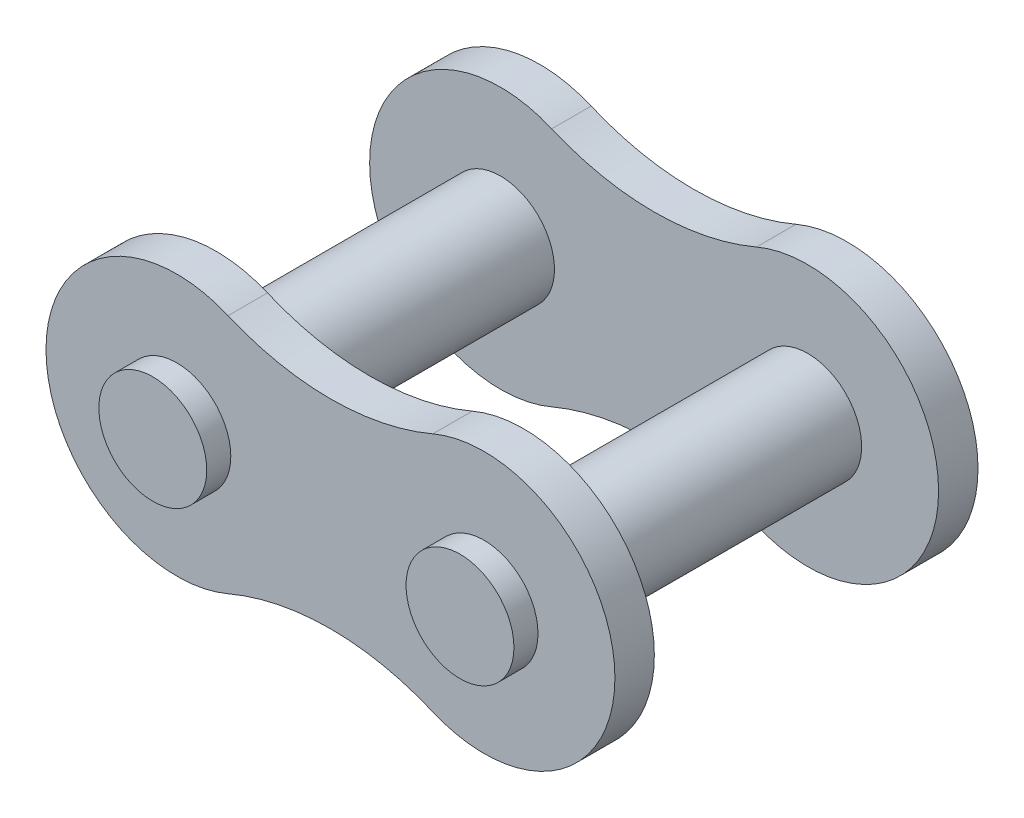
ISO-10303-21;
HEADER;
FILE_DESCRIPTION(('STEP AP214'),'2;1');
FILE_NAME('part.step','',(''),(''),'','','');
FILE_SCHEMA(('AUTOMOTIVE_DESIGN { 1 0 10303 214 1 1 1 1 }'));
ENDSEC;
DATA;
#1=APPLICATION_CONTEXT('core data for automotive mechanical design processes');
#2=APPLICATION_PROTOCOL_DEFINITION('international standard','automotive_design',2000,#1);
#3=PRODUCT_CONTEXT('',#1,'mechanical');
#4=PRODUCT('Part','Part','',(#3));
#5=PRODUCT_RELATED_PRODUCT_CATEGORY('part','',(#4));
#6=PRODUCT_DEFINITION_FORMATION('','',#4);
#7=PRODUCT_DEFINITION_CONTEXT('part definition',#1,'design');
#8=PRODUCT_DEFINITION('design','',#6,#7);
#9=PRODUCT_DEFINITION_SHAPE('','',#8);
#10=(LENGTH_UNIT() NAMED_UNIT(*) SI_UNIT(.MILLI.,.METRE.));
#11=(NAMED_UNIT(*) PLANE_ANGLE_UNIT() SI_UNIT($,.RADIAN.));
#12=(NAMED_UNIT(*) SI_UNIT($,.STERADIAN.) SOLID_ANGLE_UNIT());
#13=UNCERTAINTY_MEASURE_WITH_UNIT(LENGTH_MEASURE(1.E-05),#10,'distance_accuracy_value','');
#14=(GEOMETRIC_REPRESENTATION_CONTEXT(3) GLOBAL_UNCERTAINTY_ASSIGNED_CONTEXT((#13)) GLOBAL_UNIT_ASSIGNED_CONTEXT((#10,
#11,#12)) REPRESENTATION_CONTEXT('',''));
#15=CARTESIAN_POINT('',(0.,0.,0.));
#16=DIRECTION('',(0.,0.,1.));
#17=DIRECTION('',(1.,0.,0.));
#18=AXIS2_PLACEMENT_3D('',#15,#16,#17);
#19=CARTESIAN_POINT('',(-6.35,0.,8.5));
#20=DIRECTION('',(0.,0.,-1.));
#21=DIRECTION('',(-1.,0.,0.));
#22=AXIS2_PLACEMENT_3D('',#19,#20,#21);
#23=CYLINDRICAL_SURFACE('',#22,2.23);
#24=CARTESIAN_POINT('',(-6.35,0.,5.875));
#25=DIRECTION('',(0.,0.,1.));
#26=DIRECTION('',(1.,0.,0.));
#27=AXIS2_PLACEMENT_3D('',#24,#25,#26);
#28=CIRCLE('',#27,2.23);
#29=CARTESIAN_POINT('',(-4.12,0.,5.875));
#30=VERTEX_POINT('',#29);
#31=EDGE_CURVE('E196',#30,#30,#28,.T.);
#32=ORIENTED_EDGE('',*,*,#31,.F.);
#33=EDGE_LOOP('',(#32));
#34=FACE_BOUND('',#33,.T.);
#35=CARTESIAN_POINT('',(-6.35,0.,-5.875));
#36=DIRECTION('',(0.,0.,-1.));
#37=DIRECTION('',(-1.,0.,0.));
#38=AXIS2_PLACEMENT_3D('',#35,#36,#37);
#39=CIRCLE('',#38,2.23);
#40=CARTESIAN_POINT('',(-8.58,0.,-5.875));
#41=VERTEX_POINT('',#40);
#42=EDGE_CURVE('E11',#41,#41,#39,.T.);
#43=ORIENTED_EDGE('',*,*,#42,.F.);
#44=EDGE_LOOP('',(#43));
#45=FACE_BOUND('',#44,.T.);
#46=ADVANCED_FACE('F39',(#34,#45),#23,.T.);
#47=CARTESIAN_POINT('',(6.35,0.,8.5));
#48=DIRECTION('',(0.,0.,-1.));
#49=DIRECTION('',(-1.,0.,0.));
#50=AXIS2_PLACEMENT_3D('',#47,#48,#49);
#51=CYLINDRICAL_SURFACE('',#50,2.23);
#52=CARTESIAN_POINT('',(6.35,0.,5.875));
#53=DIRECTION('',(0.,0.,1.));
#54=DIRECTION('',(1.,0.,0.));
#55=AXIS2_PLACEMENT_3D('',#52,#53,#54);
#56=CIRCLE('',#55,2.23);
#57=CARTESIAN_POINT('',(8.58,0.,5.875));
#58=VERTEX_POINT('',#57);
#59=EDGE_CURVE('E202',#58,#58,#56,.F.);
#60=ORIENTED_EDGE('',*,*,#59,.T.);
#61=EDGE_LOOP('',(#60));
#62=FACE_BOUND('',#61,.T.);
#63=CARTESIAN_POINT('',(6.35,0.,-5.875));
#64=DIRECTION('',(0.,0.,-1.));
#65=DIRECTION('',(-1.,0.,0.));
#66=AXIS2_PLACEMENT_3D('',#63,#64,#65);
#67=CIRCLE('',#66,2.23);
#68=CARTESIAN_POINT('',(4.12,0.,-5.875));
#69=VERTEX_POINT('',#68);
#70=EDGE_CURVE('E49',#69,#69,#67,.T.);
#71=ORIENTED_EDGE('',*,*,#70,.F.);
#72=EDGE_LOOP('',(#71));
#73=FACE_BOUND('',#72,.T.);
#74=ADVANCED_FACE('F212',(#62,#73),#51,.T.);
#75=CARTESIAN_POINT('',(-6.35,0.,7.505));
#76=DIRECTION('',(0.,0.,1.));
#77=DIRECTION('',(1.,0.,0.));
#78=AXIS2_PLACEMENT_3D('',#75,#76,#77);
#79=CIRCLE('',#78,2.23);
#80=CARTESIAN_POINT('',(-4.12,0.,7.505));
#81=VERTEX_POINT('',#80);
#82=EDGE_CURVE('E192',#81,#81,#79,.T.);
#83=ORIENTED_EDGE('',*,*,#82,.T.);
#84=EDGE_LOOP('',(#83));
#85=FACE_BOUND('',#84,.T.);
#86=CARTESIAN_POINT('',(-6.35,0.,8.5));
#87=DIRECTION('',(0.,0.,1.));
#88=DIRECTION('',(1.,0.,0.));
#89=AXIS2_PLACEMENT_3D('',#86,#87,#88);
#90=CIRCLE('',#89,2.23);
#91=CARTESIAN_POINT('',(-4.12,0.,8.5));
#92=VERTEX_POINT('',#91);
#93=EDGE_CURVE('E193',#92,#92,#90,.T.);
#94=ORIENTED_EDGE('',*,*,#93,.F.);
#95=EDGE_LOOP('',(#94));
#96=FACE_BOUND('',#95,.T.);
#97=ADVANCED_FACE('F41',(#85,#96),#23,.T.);
#98=CARTESIAN_POINT('',(-6.35,0.,8.5));
#99=DIRECTION('',(0.,0.,1.));
#100=DIRECTION('',(1.,0.,0.));
#101=AXIS2_PLACEMENT_3D('',#98,#99,#100);
#102=PLANE('',#101);
#103=ORIENTED_EDGE('',*,*,#93,.T.);
#104=EDGE_LOOP('',(#103));
#105=FACE_BOUND('',#104,.T.);
#106=ADVANCED_FACE('F223',(#105),#102,.T.);
#107=CARTESIAN_POINT('',(0.,-14.9253442171362,7.505));
#108=DIRECTION('',(0.,0.,-1.));
#109=DIRECTION('',(-1.,0.,0.));
#110=AXIS2_PLACEMENT_3D('',#107,#108,#109);
#111=CYLINDRICAL_SURFACE('',#110,10.81);
#112=CARTESIAN_POINT('',(0.,-14.9253442171362,5.875));
#113=DIRECTION('',(0.,0.,-1.));
#114=DIRECTION('',(1.,0.,0.));
#115=AXIS2_PLACEMENT_3D('',#112,#113,#114);
#116=CIRCLE('',#115,10.81);
#117=CARTESIAN_POINT('',(-4.23202836004932,-4.97818201077106,5.875));
#118=VERTEX_POINT('',#117);
#119=CARTESIAN_POINT('',(4.23202836004932,-4.97818201077106,5.875));
#120=VERTEX_POINT('',#119);
#121=EDGE_CURVE('E171',#118,#120,#116,.T.);
#122=ORIENTED_EDGE('',*,*,#121,.T.);
#123=DIRECTION('',(0.,0.,-1.));
#124=VECTOR('',#123,1.);
#125=CARTESIAN_POINT('',(4.23202836004932,-4.97818201077106,7.505));
#126=LINE('',#125,#124);
#127=CARTESIAN_POINT('',(4.23202836004932,-4.97818201077106,7.505));
#128=VERTEX_POINT('',#127);
#129=EDGE_CURVE('E190',#128,#120,#126,.T.);
#130=ORIENTED_EDGE('',*,*,#129,.F.);
#131=CARTESIAN_POINT('',(0.,-14.9253442171362,7.505));
#132=DIRECTION('',(0.,0.,-1.));
#133=DIRECTION('',(1.,0.,0.));
#134=AXIS2_PLACEMENT_3D('',#131,#132,#133);
#135=CIRCLE('',#134,10.81);
#136=CARTESIAN_POINT('',(-4.23202836004932,-4.97818201077106,7.505));
#137=VERTEX_POINT('',#136);
#138=EDGE_CURVE('E172',#137,#128,#135,.T.);
#139=ORIENTED_EDGE('',*,*,#138,.F.);
#140=DIRECTION('',(0.,0.,-1.));
#141=VECTOR('',#140,1.);
#142=CARTESIAN_POINT('',(-4.23202836004932,-4.97818201077106,7.505));
#143=LINE('',#142,#141);
#144=EDGE_CURVE('E178',#137,#118,#143,.T.);
#145=ORIENTED_EDGE('',*,*,#144,.T.);
#146=EDGE_LOOP('',(#122,#130,#139,#145));
#147=FACE_BOUND('',#146,.T.);
#148=ADVANCED_FACE('F258',(#147),#111,.F.);
#149=CARTESIAN_POINT('',(6.35,0.,7.505));
#150=DIRECTION('',(0.,0.,-1.));
#151=DIRECTION('',(-1.,0.,0.));
#152=AXIS2_PLACEMENT_3D('',#149,#150,#151);
#153=CYLINDRICAL_SURFACE('',#152,5.41);
#154=CARTESIAN_POINT('',(6.35,0.,5.875));
#155=DIRECTION('',(0.,0.,1.));
#156=DIRECTION('',(1.,0.,0.));
#157=AXIS2_PLACEMENT_3D('',#154,#155,#156);
#158=CIRCLE('',#157,5.41);
#159=CARTESIAN_POINT('',(4.23202836004932,4.97818201077106,5.875));
#160=VERTEX_POINT('',#159);
#161=EDGE_CURVE('E181',#120,#160,#158,.T.);
#162=ORIENTED_EDGE('',*,*,#161,.T.);
#163=DIRECTION('',(0.,0.,-1.));
#164=VECTOR('',#163,1.);
#165=CARTESIAN_POINT('',(4.23202836004932,4.97818201077106,7.505));
#166=LINE('',#165,#164);
#167=CARTESIAN_POINT('',(4.23202836004932,4.97818201077106,7.505));
#168=VERTEX_POINT('',#167);
#169=EDGE_CURVE('E188',#168,#160,#166,.T.);
#170=ORIENTED_EDGE('',*,*,#169,.F.);
#171=CARTESIAN_POINT('',(6.35,0.,7.505));
#172=DIRECTION('',(0.,0.,1.));
#173=DIRECTION('',(1.,0.,0.));
#174=AXIS2_PLACEMENT_3D('',#171,#172,#173);
#175=CIRCLE('',#174,5.41);
#176=EDGE_CURVE('E90',#128,#168,#175,.T.);
#177=ORIENTED_EDGE('',*,*,#176,.F.);
#178=ORIENTED_EDGE('',*,*,#129,.T.);
#179=EDGE_LOOP('',(#162,#170,#177,#178));
#180=FACE_BOUND('',#179,.T.);
#181=ADVANCED_FACE('F260',(#180),#153,.T.);
#182=CARTESIAN_POINT('',(0.,14.9253442171362,7.505));
#183=DIRECTION('',(0.,0.,-1.));
#184=DIRECTION('',(-1.,0.,0.));
#185=AXIS2_PLACEMENT_3D('',#182,#183,#184);
#186=CYLINDRICAL_SURFACE('',#185,10.81);
#187=CARTESIAN_POINT('',(0.,14.9253442171362,5.875));
#188=DIRECTION('',(0.,0.,-1.));
#189=DIRECTION('',(1.,0.,0.));
#190=AXIS2_PLACEMENT_3D('',#187,#188,#189);
#191=CIRCLE('',#190,10.81);
#192=CARTESIAN_POINT('',(-4.23202836004932,4.97818201077106,5.875));
#193=VERTEX_POINT('',#192);
#194=EDGE_CURVE('E76',#160,#193,#191,.T.);
#195=ORIENTED_EDGE('',*,*,#194,.T.);
#196=DIRECTION('',(0.,0.,-1.));
#197=VECTOR('',#196,1.);
#198=CARTESIAN_POINT('',(-4.23202836004932,4.97818201077106,7.505));
#199=LINE('',#198,#197);
#200=CARTESIAN_POINT('',(-4.23202836004932,4.97818201077106,7.505));
#201=VERTEX_POINT('',#200);
#202=EDGE_CURVE('E186',#201,#193,#199,.T.);
#203=ORIENTED_EDGE('',*,*,#202,.F.);
#204=CARTESIAN_POINT('',(0.,14.9253442171362,7.505));
#205=DIRECTION('',(0.,0.,-1.));
#206=DIRECTION('',(1.,0.,0.));
#207=AXIS2_PLACEMENT_3D('',#204,#205,#206);
#208=CIRCLE('',#207,10.81);
#209=EDGE_CURVE('E175',#168,#201,#208,.T.);
#210=ORIENTED_EDGE('',*,*,#209,.F.);
#211=ORIENTED_EDGE('',*,*,#169,.T.);
#212=EDGE_LOOP('',(#195,#203,#210,#211));
#213=FACE_BOUND('',#212,.T.);
#214=ADVANCED_FACE('F263',(#213),#186,.F.);
#215=CARTESIAN_POINT('',(-6.35,0.,7.505));
#216=DIRECTION('',(0.,0.,-1.));
#217=DIRECTION('',(-1.,0.,0.));
#218=AXIS2_PLACEMENT_3D('',#215,#216,#217);
#219=CYLINDRICAL_SURFACE('',#218,5.41);
#220=CARTESIAN_POINT('',(-6.35,0.,5.875));
#221=DIRECTION('',(0.,0.,1.));
#222=DIRECTION('',(1.,0.,0.));
#223=AXIS2_PLACEMENT_3D('',#220,#221,#222);
#224=CIRCLE('',#223,5.41);
#225=EDGE_CURVE('E82',#193,#118,#224,.T.);
#226=ORIENTED_EDGE('',*,*,#225,.T.);
#227=ORIENTED_EDGE('',*,*,#144,.F.);
#228=CARTESIAN_POINT('',(-6.35,0.,7.505));
#229=DIRECTION('',(0.,0.,1.));
#230=DIRECTION('',(1.,0.,0.));
#231=AXIS2_PLACEMENT_3D('',#228,#229,#230);
#232=CIRCLE('',#231,5.41);
#233=EDGE_CURVE('E58',#201,#137,#232,.T.);
#234=ORIENTED_EDGE('',*,*,#233,.F.);
#235=ORIENTED_EDGE('',*,*,#202,.T.);
#236=EDGE_LOOP('',(#226,#227,#234,#235));
#237=FACE_BOUND('',#236,.T.);
#238=ADVANCED_FACE('F253',(#237),#219,.T.);
#239=CARTESIAN_POINT('',(-3.175,-7.46267210856808,7.505));
#240=DIRECTION('',(0.,0.,1.));
#241=DIRECTION('',(1.,0.,0.));
#242=AXIS2_PLACEMENT_3D('',#239,#240,#241);
#243=PLANE('',#242);
#244=CARTESIAN_POINT('',(6.35,0.,7.505));
#245=DIRECTION('',(0.,0.,1.));
#246=DIRECTION('',(1.,0.,0.));
#247=AXIS2_PLACEMENT_3D('',#244,#245,#246);
#248=CIRCLE('',#247,2.23);
#249=CARTESIAN_POINT('',(8.58,0.,7.505));
#250=VERTEX_POINT('',#249);
#251=EDGE_CURVE('E166',#250,#250,#248,.F.);
#252=ORIENTED_EDGE('',*,*,#251,.T.);
#253=EDGE_LOOP('',(#252));
#254=FACE_BOUND('',#253,.T.);
#255=ORIENTED_EDGE('',*,*,#82,.F.);
#256=EDGE_LOOP('',(#255));
#257=FACE_BOUND('',#256,.T.);
#258=ORIENTED_EDGE('',*,*,#138,.T.);
#259=ORIENTED_EDGE('',*,*,#176,.T.);
#260=ORIENTED_EDGE('',*,*,#209,.T.);
#261=ORIENTED_EDGE('',*,*,#233,.T.);
#262=EDGE_LOOP('',(#258,#259,#260,#261));
#263=FACE_BOUND('',#262,.T.);
#264=ADVANCED_FACE('F244',(#254,#257,#263),#243,.T.);
#265=CARTESIAN_POINT('',(-3.175,-7.46267210856808,5.875));
#266=DIRECTION('',(0.,0.,1.));
#267=DIRECTION('',(1.,0.,0.));
#268=AXIS2_PLACEMENT_3D('',#265,#266,#267);
#269=PLANE('',#268);
#270=ORIENTED_EDGE('',*,*,#59,.F.);
#271=EDGE_LOOP('',(#270));
#272=FACE_BOUND('',#271,.T.);
#273=ORIENTED_EDGE('',*,*,#31,.T.);
#274=EDGE_LOOP('',(#273));
#275=FACE_BOUND('',#274,.T.);
#276=ORIENTED_EDGE('',*,*,#121,.F.);
#277=ORIENTED_EDGE('',*,*,#225,.F.);
#278=ORIENTED_EDGE('',*,*,#194,.F.);
#279=ORIENTED_EDGE('',*,*,#161,.F.);
#280=EDGE_LOOP('',(#276,#277,#278,#279));
#281=FACE_BOUND('',#280,.T.);
#282=ADVANCED_FACE('F235',(#272,#275,#281),#269,.F.);
#283=ORIENTED_EDGE('',*,*,#251,.F.);
#284=EDGE_LOOP('',(#283));
#285=FACE_BOUND('',#284,.T.);
#286=CARTESIAN_POINT('',(6.35,0.,8.5));
#287=DIRECTION('',(0.,0.,1.));
#288=DIRECTION('',(1.,0.,0.));
#289=AXIS2_PLACEMENT_3D('',#286,#287,#288);
#290=CIRCLE('',#289,2.23);
#291=CARTESIAN_POINT('',(8.58,0.,8.5));
#292=VERTEX_POINT('',#291);
#293=EDGE_CURVE('E163',#292,#292,#290,.T.);
#294=ORIENTED_EDGE('',*,*,#293,.F.);
#295=EDGE_LOOP('',(#294));
#296=FACE_BOUND('',#295,.T.);
#297=ADVANCED_FACE('F217',(#285,#296),#51,.T.);
#298=CARTESIAN_POINT('',(6.35,0.,8.5));
#299=DIRECTION('',(0.,0.,1.));
#300=DIRECTION('',(1.,0.,0.));
#301=AXIS2_PLACEMENT_3D('',#298,#299,#300);
#302=PLANE('',#301);
#303=ORIENTED_EDGE('',*,*,#293,.T.);
#304=EDGE_LOOP('',(#303));
#305=FACE_BOUND('',#304,.T.);
#306=ADVANCED_FACE('F234',(#305),#302,.T.);
#307=CARTESIAN_POINT('',(0.,-14.9253442171362,-7.505));
#308=DIRECTION('',(0.,0.,1.));
#309=DIRECTION('',(1.,0.,0.));
#310=AXIS2_PLACEMENT_3D('',#307,#308,#309);
#311=CYLINDRICAL_SURFACE('',#310,10.81);
#312=CARTESIAN_POINT('',(0.,-14.9253442171362,-5.875));
#313=DIRECTION('',(0.,0.,-1.));
#314=DIRECTION('',(1.,0.,0.));
#315=AXIS2_PLACEMENT_3D('',#312,#313,#314);
#316=CIRCLE('',#315,10.81);
#317=CARTESIAN_POINT('',(-4.23202836004932,-4.97818201077106,-5.875));
#318=VERTEX_POINT('',#317);
#319=CARTESIAN_POINT('',(4.23202836004932,-4.97818201077106,-5.875));
#320=VERTEX_POINT('',#319);
#321=EDGE_CURVE('E123',#318,#320,#316,.T.);
#322=ORIENTED_EDGE('',*,*,#321,.F.);
#323=DIRECTION('',(0.,0.,1.));
#324=VECTOR('',#323,1.);
#325=CARTESIAN_POINT('',(-4.23202836004932,-4.97818201077106,-7.505));
#326=LINE('',#325,#324);
#327=CARTESIAN_POINT('',(-4.23202836004932,-4.97818201077106,-7.505));
#328=VERTEX_POINT('',#327);
#329=EDGE_CURVE('E117',#328,#318,#326,.T.);
#330=ORIENTED_EDGE('',*,*,#329,.F.);
#331=CARTESIAN_POINT('',(0.,-14.9253442171362,-7.505));
#332=DIRECTION('',(0.,0.,-1.));
#333=DIRECTION('',(1.,0.,0.));
#334=AXIS2_PLACEMENT_3D('',#331,#332,#333);
#335=CIRCLE('',#334,10.81);
#336=CARTESIAN_POINT('',(4.23202836004932,-4.97818201077106,-7.505));
#337=VERTEX_POINT('',#336);
#338=EDGE_CURVE('E120',#328,#337,#335,.T.);
#339=ORIENTED_EDGE('',*,*,#338,.T.);
#340=DIRECTION('',(0.,0.,1.));
#341=VECTOR('',#340,1.);
#342=CARTESIAN_POINT('',(4.23202836004932,-4.97818201077106,-7.505));
#343=LINE('',#342,#341);
#344=EDGE_CURVE('E146',#337,#320,#343,.T.);
#345=ORIENTED_EDGE('',*,*,#344,.T.);
#346=EDGE_LOOP('',(#322,#330,#339,#345));
#347=FACE_BOUND('',#346,.T.);
#348=ADVANCED_FACE('F119',(#347),#311,.F.);
#349=CARTESIAN_POINT('',(-6.35,0.,-7.505));
#350=DIRECTION('',(0.,0.,1.));
#351=DIRECTION('',(1.,0.,0.));
#352=AXIS2_PLACEMENT_3D('',#349,#350,#351);
#353=CYLINDRICAL_SURFACE('',#352,5.41);
#354=CARTESIAN_POINT('',(-6.35,0.,-5.875));
#355=DIRECTION('',(0.,0.,1.));
#356=DIRECTION('',(1.,0.,0.));
#357=AXIS2_PLACEMENT_3D('',#354,#355,#356);
#358=CIRCLE('',#357,5.41);
#359=CARTESIAN_POINT('',(-4.23202836004932,4.97818201077106,-5.875));
#360=VERTEX_POINT('',#359);
#361=EDGE_CURVE('E148',#360,#318,#358,.T.);
#362=ORIENTED_EDGE('',*,*,#361,.F.);
#363=DIRECTION('',(0.,0.,1.));
#364=VECTOR('',#363,1.);
#365=CARTESIAN_POINT('',(-4.23202836004932,4.97818201077106,-7.505));
#366=LINE('',#365,#364);
#367=CARTESIAN_POINT('',(-4.23202836004932,4.97818201077106,-7.505));
#368=VERTEX_POINT('',#367);
#369=EDGE_CURVE('E128',#368,#360,#366,.T.);
#370=ORIENTED_EDGE('',*,*,#369,.F.);
#371=CARTESIAN_POINT('',(-6.35,0.,-7.505));
#372=DIRECTION('',(0.,0.,1.));
#373=DIRECTION('',(1.,0.,0.));
#374=AXIS2_PLACEMENT_3D('',#371,#372,#373);
#375=CIRCLE('',#374,5.41);
#376=EDGE_CURVE('E134',#368,#328,#375,.T.);
#377=ORIENTED_EDGE('',*,*,#376,.T.);
#378=ORIENTED_EDGE('',*,*,#329,.T.);
#379=EDGE_LOOP('',(#362,#370,#377,#378));
#380=FACE_BOUND('',#379,.T.);
#381=ADVANCED_FACE('F140',(#380),#353,.T.);
#382=CARTESIAN_POINT('',(0.,14.9253442171362,-7.505));
#383=DIRECTION('',(0.,0.,1.));
#384=DIRECTION('',(1.,0.,0.));
#385=AXIS2_PLACEMENT_3D('',#382,#383,#384);
#386=CYLINDRICAL_SURFACE('',#385,10.81);
#387=CARTESIAN_POINT('',(0.,14.9253442171362,-5.875));
#388=DIRECTION('',(0.,0.,-1.));
#389=DIRECTION('',(1.,0.,0.));
#390=AXIS2_PLACEMENT_3D('',#387,#388,#389);
#391=CIRCLE('',#390,10.81);
#392=CARTESIAN_POINT('',(4.23202836004932,4.97818201077106,-5.875));
#393=VERTEX_POINT('',#392);
#394=EDGE_CURVE('E150',#393,#360,#391,.T.);
#395=ORIENTED_EDGE('',*,*,#394,.F.);
#396=DIRECTION('',(0.,0.,1.));
#397=VECTOR('',#396,1.);
#398=CARTESIAN_POINT('',(4.23202836004932,4.97818201077106,-7.505));
#399=LINE('',#398,#397);
#400=CARTESIAN_POINT('',(4.23202836004932,4.97818201077106,-7.505));
#401=VERTEX_POINT('',#400);
#402=EDGE_CURVE('E156',#401,#393,#399,.T.);
#403=ORIENTED_EDGE('',*,*,#402,.F.);
#404=CARTESIAN_POINT('',(0.,14.9253442171362,-7.505));
#405=DIRECTION('',(0.,0.,-1.));
#406=DIRECTION('',(1.,0.,0.));
#407=AXIS2_PLACEMENT_3D('',#404,#405,#406);
#408=CIRCLE('',#407,10.81);
#409=EDGE_CURVE('E141',#401,#368,#408,.T.);
#410=ORIENTED_EDGE('',*,*,#409,.T.);
#411=ORIENTED_EDGE('',*,*,#369,.T.);
#412=EDGE_LOOP('',(#395,#403,#410,#411));
#413=FACE_BOUND('',#412,.T.);
#414=ADVANCED_FACE('F307',(#413),#386,.F.);
#415=CARTESIAN_POINT('',(6.35,0.,-7.505));
#416=DIRECTION('',(0.,0.,1.));
#417=DIRECTION('',(1.,0.,0.));
#418=AXIS2_PLACEMENT_3D('',#415,#416,#417);
#419=CYLINDRICAL_SURFACE('',#418,5.41);
#420=CARTESIAN_POINT('',(6.35,0.,-5.875));
#421=DIRECTION('',(0.,0.,1.));
#422=DIRECTION('',(1.,0.,0.));
#423=AXIS2_PLACEMENT_3D('',#420,#421,#422);
#424=CIRCLE('',#423,5.41);
#425=EDGE_CURVE('E138',#320,#393,#424,.T.);
#426=ORIENTED_EDGE('',*,*,#425,.F.);
#427=ORIENTED_EDGE('',*,*,#344,.F.);
#428=CARTESIAN_POINT('',(6.35,0.,-7.505));
#429=DIRECTION('',(0.,0.,1.));
#430=DIRECTION('',(1.,0.,0.));
#431=AXIS2_PLACEMENT_3D('',#428,#429,#430);
#432=CIRCLE('',#431,5.41);
#433=EDGE_CURVE('E137',#337,#401,#432,.T.);
#434=ORIENTED_EDGE('',*,*,#433,.T.);
#435=ORIENTED_EDGE('',*,*,#402,.T.);
#436=EDGE_LOOP('',(#426,#427,#434,#435));
#437=FACE_BOUND('',#436,.T.);
#438=ADVANCED_FACE('F291',(#437),#419,.T.);
#439=CARTESIAN_POINT('',(-3.175,-7.46267210856808,-7.505));
#440=DIRECTION('',(0.,0.,-1.));
#441=DIRECTION('',(1.,0.,0.));
#442=AXIS2_PLACEMENT_3D('',#439,#440,#441);
#443=PLANE('',#442);
#444=CARTESIAN_POINT('',(-6.35,0.,-7.505));
#445=DIRECTION('',(0.,0.,-1.));
#446=DIRECTION('',(-1.,0.,0.));
#447=AXIS2_PLACEMENT_3D('',#444,#445,#446);
#448=CIRCLE('',#447,2.23);
#449=CARTESIAN_POINT('',(-8.58,0.,-7.505));
#450=VERTEX_POINT('',#449);
#451=EDGE_CURVE('E159',#450,#450,#448,.T.);
#452=ORIENTED_EDGE('',*,*,#451,.F.);
#453=EDGE_LOOP('',(#452));
#454=FACE_BOUND('',#453,.T.);
#455=CARTESIAN_POINT('',(6.35,0.,-7.505));
#456=DIRECTION('',(0.,0.,-1.));
#457=DIRECTION('',(-1.,0.,0.));
#458=AXIS2_PLACEMENT_3D('',#455,#456,#457);
#459=CIRCLE('',#458,2.23);
#460=CARTESIAN_POINT('',(4.12,0.,-7.505));
#461=VERTEX_POINT('',#460);
#462=EDGE_CURVE('E43',#461,#461,#459,.T.);
#463=ORIENTED_EDGE('',*,*,#462,.F.);
#464=EDGE_LOOP('',(#463));
#465=FACE_BOUND('',#464,.T.);
#466=ORIENTED_EDGE('',*,*,#338,.F.);
#467=ORIENTED_EDGE('',*,*,#376,.F.);
#468=ORIENTED_EDGE('',*,*,#409,.F.);
#469=ORIENTED_EDGE('',*,*,#433,.F.);
#470=EDGE_LOOP('',(#466,#467,#468,#469));
#471=FACE_BOUND('',#470,.T.);
#472=ADVANCED_FACE('F132',(#454,#465,#471),#443,.T.);
#473=CARTESIAN_POINT('',(-3.175,-7.46267210856808,-5.875));
#474=DIRECTION('',(0.,0.,-1.));
#475=DIRECTION('',(1.,0.,0.));
#476=AXIS2_PLACEMENT_3D('',#473,#474,#475);
#477=PLANE('',#476);
#478=ORIENTED_EDGE('',*,*,#42,.T.);
#479=EDGE_LOOP('',(#478));
#480=FACE_BOUND('',#479,.T.);
#481=ORIENTED_EDGE('',*,*,#70,.T.);
#482=EDGE_LOOP('',(#481));
#483=FACE_BOUND('',#482,.T.);
#484=ORIENTED_EDGE('',*,*,#321,.T.);
#485=ORIENTED_EDGE('',*,*,#425,.T.);
#486=ORIENTED_EDGE('',*,*,#394,.T.);
#487=ORIENTED_EDGE('',*,*,#361,.T.);
#488=EDGE_LOOP('',(#484,#485,#486,#487));
#489=FACE_BOUND('',#488,.T.);
#490=ADVANCED_FACE('F209',(#480,#483,#489),#477,.F.);
#491=CARTESIAN_POINT('',(6.35,0.,-8.5));
#492=DIRECTION('',(0.,0.,1.));
#493=DIRECTION('',(1.,0.,0.));
#494=AXIS2_PLACEMENT_3D('',#491,#492,#493);
#495=PLANE('',#494);
#496=CARTESIAN_POINT('',(6.35,0.,-8.5));
#497=DIRECTION('',(0.,0.,1.));
#498=DIRECTION('',(1.,0.,0.));
#499=AXIS2_PLACEMENT_3D('',#496,#497,#498);
#500=CIRCLE('',#499,2.23);
#501=CARTESIAN_POINT('',(8.58,0.,-8.5));
#502=VERTEX_POINT('',#501);
#503=EDGE_CURVE('E162',#502,#502,#500,.T.);
#504=ORIENTED_EDGE('',*,*,#503,.F.);
#505=EDGE_LOOP('',(#504));
#506=FACE_BOUND('',#505,.T.);
#507=ADVANCED_FACE('F231',(#506),#495,.F.);
#508=ORIENTED_EDGE('',*,*,#462,.T.);
#509=EDGE_LOOP('',(#508));
#510=FACE_BOUND('',#509,.T.);
#511=ORIENTED_EDGE('',*,*,#503,.T.);
#512=EDGE_LOOP('',(#511));
#513=FACE_BOUND('',#512,.T.);
#514=ADVANCED_FACE('F216',(#510,#513),#51,.T.);
#515=CARTESIAN_POINT('',(-6.35,0.,-8.5));
#516=DIRECTION('',(0.,0.,1.));
#517=DIRECTION('',(1.,0.,0.));
#518=AXIS2_PLACEMENT_3D('',#515,#516,#517);
#519=PLANE('',#518);
#520=CARTESIAN_POINT('',(-6.35,0.,-8.5));
#521=DIRECTION('',(0.,0.,1.));
#522=DIRECTION('',(1.,0.,0.));
#523=AXIS2_PLACEMENT_3D('',#520,#521,#522);
#524=CIRCLE('',#523,2.23);
#525=CARTESIAN_POINT('',(-4.12,0.,-8.5));
#526=VERTEX_POINT('',#525);
#527=EDGE_CURVE('E197',#526,#526,#524,.T.);
#528=ORIENTED_EDGE('',*,*,#527,.F.);
#529=EDGE_LOOP('',(#528));
#530=FACE_BOUND('',#529,.T.);
#531=ADVANCED_FACE('F230',(#530),#519,.F.);
#532=ORIENTED_EDGE('',*,*,#451,.T.);
#533=EDGE_LOOP('',(#532));
#534=FACE_BOUND('',#533,.T.);
#535=ORIENTED_EDGE('',*,*,#527,.T.);
#536=EDGE_LOOP('',(#535));
#537=FACE_BOUND('',#536,.T.);
#538=ADVANCED_FACE('F225',(#534,#537),#23,.T.);
#539=CLOSED_SHELL('',(#46,#74,#97,#106,#148,#181,#214,#238,#264,#282,#297,#306,#348,#381,#414,
#438,#472,#490,#507,#514,#531,#538));
#540=MANIFOLD_SOLID_BREP('B2',#539);
#541=ADVANCED_BREP_SHAPE_REPRESENTATION('',(#18,#540),#14);
#542=SHAPE_DEFINITION_REPRESENTATION(#9,#541);
ENDSEC;
END-ISO-10303-21;
